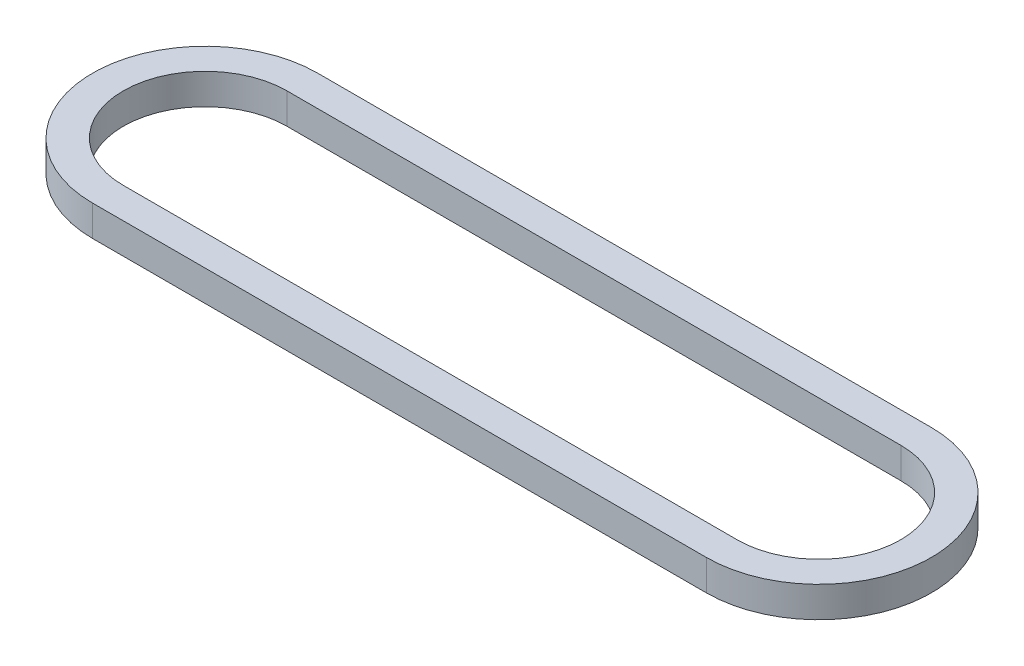
ISO-10303-21;
HEADER;
FILE_DESCRIPTION(('STEP AP214'),'2;1');
FILE_NAME('part.step','',(''),(''),'','','');
FILE_SCHEMA(('AUTOMOTIVE_DESIGN { 1 0 10303 214 1 1 1 1 }'));
ENDSEC;
DATA;
#1=APPLICATION_CONTEXT('core data for automotive mechanical design processes');
#2=APPLICATION_PROTOCOL_DEFINITION('international standard','automotive_design',2000,#1);
#3=PRODUCT_CONTEXT('',#1,'mechanical');
#4=PRODUCT('Part','Part','',(#3));
#5=PRODUCT_RELATED_PRODUCT_CATEGORY('part','',(#4));
#6=PRODUCT_DEFINITION_FORMATION('','',#4);
#7=PRODUCT_DEFINITION_CONTEXT('part definition',#1,'design');
#8=PRODUCT_DEFINITION('design','',#6,#7);
#9=PRODUCT_DEFINITION_SHAPE('','',#8);
#10=(LENGTH_UNIT() NAMED_UNIT(*) SI_UNIT(.MILLI.,.METRE.));
#11=(NAMED_UNIT(*) PLANE_ANGLE_UNIT() SI_UNIT($,.RADIAN.));
#12=(NAMED_UNIT(*) SI_UNIT($,.STERADIAN.) SOLID_ANGLE_UNIT());
#13=UNCERTAINTY_MEASURE_WITH_UNIT(LENGTH_MEASURE(1.E-05),#10,'distance_accuracy_value','');
#14=(GEOMETRIC_REPRESENTATION_CONTEXT(3) GLOBAL_UNCERTAINTY_ASSIGNED_CONTEXT((#13)) GLOBAL_UNIT_ASSIGNED_CONTEXT((#10,
#11,#12)) REPRESENTATION_CONTEXT('',''));
#15=CARTESIAN_POINT('',(0.,0.,0.));
#16=DIRECTION('',(0.,0.,1.));
#17=DIRECTION('',(1.,0.,0.));
#18=AXIS2_PLACEMENT_3D('',#15,#16,#17);
#19=CARTESIAN_POINT('',(-76.2,7.62,0.));
#20=DIRECTION('',(0.,1.,0.));
#21=DIRECTION('',(0.,0.,1.));
#22=AXIS2_PLACEMENT_3D('',#19,#20,#21);
#23=PLANE('',#22);
#24=CARTESIAN_POINT('',(-76.2,7.62,0.));
#25=DIRECTION('',(0.,1.,0.));
#26=DIRECTION('',(0.,0.,1.));
#27=AXIS2_PLACEMENT_3D('',#24,#25,#26);
#28=CIRCLE('',#27,27.94);
#29=CARTESIAN_POINT('',(-76.2,7.62,-27.94));
#30=VERTEX_POINT('',#29);
#31=CARTESIAN_POINT('',(-76.2,7.62,27.94));
#32=VERTEX_POINT('',#31);
#33=EDGE_CURVE('E153',#30,#32,#28,.T.);
#34=ORIENTED_EDGE('',*,*,#33,.T.);
#35=DIRECTION('',(1.,0.,0.));
#36=VECTOR('',#35,1.);
#37=CARTESIAN_POINT('',(-76.2,7.62,27.94));
#38=LINE('',#37,#36);
#39=CARTESIAN_POINT('',(76.2,7.62,27.94));
#40=VERTEX_POINT('',#39);
#41=EDGE_CURVE('E157',#32,#40,#38,.T.);
#42=ORIENTED_EDGE('',*,*,#41,.T.);
#43=CARTESIAN_POINT('',(76.2,7.62,0.));
#44=DIRECTION('',(0.,1.,0.));
#45=DIRECTION('',(0.,0.,1.));
#46=AXIS2_PLACEMENT_3D('',#43,#44,#45);
#47=CIRCLE('',#46,27.94);
#48=CARTESIAN_POINT('',(76.2,7.62,-27.94));
#49=VERTEX_POINT('',#48);
#50=EDGE_CURVE('E161',#40,#49,#47,.T.);
#51=ORIENTED_EDGE('',*,*,#50,.T.);
#52=DIRECTION('',(-1.,0.,0.));
#53=VECTOR('',#52,1.);
#54=CARTESIAN_POINT('',(-76.2,7.62,-27.94));
#55=LINE('',#54,#53);
#56=EDGE_CURVE('E164',#49,#30,#55,.T.);
#57=ORIENTED_EDGE('',*,*,#56,.T.);
#58=EDGE_LOOP('',(#34,#42,#51,#57));
#59=FACE_BOUND('',#58,.T.);
#60=DIRECTION('',(1.,0.,0.));
#61=VECTOR('',#60,1.);
#62=CARTESIAN_POINT('',(-76.2,7.62,20.32));
#63=LINE('',#62,#61);
#64=CARTESIAN_POINT('',(-76.2,7.62,20.32));
#65=VERTEX_POINT('',#64);
#66=CARTESIAN_POINT('',(76.2,7.62,20.32));
#67=VERTEX_POINT('',#66);
#68=EDGE_CURVE('E114',#65,#67,#63,.T.);
#69=ORIENTED_EDGE('',*,*,#68,.F.);
#70=CARTESIAN_POINT('',(-76.2,7.62,0.));
#71=DIRECTION('',(0.,1.,0.));
#72=DIRECTION('',(0.,0.,1.));
#73=AXIS2_PLACEMENT_3D('',#70,#71,#72);
#74=CIRCLE('',#73,20.32);
#75=CARTESIAN_POINT('',(-76.2,7.62,-20.32));
#76=VERTEX_POINT('',#75);
#77=EDGE_CURVE('E105',#76,#65,#74,.T.);
#78=ORIENTED_EDGE('',*,*,#77,.F.);
#79=DIRECTION('',(-1.,0.,0.));
#80=VECTOR('',#79,1.);
#81=CARTESIAN_POINT('',(-76.2,7.62,-20.32));
#82=LINE('',#81,#80);
#83=CARTESIAN_POINT('',(76.2,7.62,-20.3200000000001));
#84=VERTEX_POINT('',#83);
#85=EDGE_CURVE('E131',#84,#76,#82,.T.);
#86=ORIENTED_EDGE('',*,*,#85,.F.);
#87=CARTESIAN_POINT('',(76.2,7.62,0.));
#88=DIRECTION('',(0.,1.,0.));
#89=DIRECTION('',(0.,0.,1.));
#90=AXIS2_PLACEMENT_3D('',#87,#88,#89);
#91=CIRCLE('',#90,20.32);
#92=EDGE_CURVE('E127',#67,#84,#91,.T.);
#93=ORIENTED_EDGE('',*,*,#92,.F.);
#94=EDGE_LOOP('',(#69,#78,#86,#93));
#95=FACE_BOUND('',#94,.T.);
#96=ADVANCED_FACE('F39',(#59,#95),#23,.T.);
#97=CARTESIAN_POINT('',(-76.2,0.,0.));
#98=DIRECTION('',(0.,1.,0.));
#99=DIRECTION('',(0.,0.,1.));
#100=AXIS2_PLACEMENT_3D('',#97,#98,#99);
#101=PLANE('',#100);
#102=CARTESIAN_POINT('',(-76.2,0.,0.));
#103=DIRECTION('',(0.,1.,0.));
#104=DIRECTION('',(0.,0.,1.));
#105=AXIS2_PLACEMENT_3D('',#102,#103,#104);
#106=CIRCLE('',#105,27.94);
#107=CARTESIAN_POINT('',(-76.2,0.,-27.94));
#108=VERTEX_POINT('',#107);
#109=CARTESIAN_POINT('',(-76.2,0.,27.94));
#110=VERTEX_POINT('',#109);
#111=EDGE_CURVE('E123',#108,#110,#106,.T.);
#112=ORIENTED_EDGE('',*,*,#111,.F.);
#113=DIRECTION('',(-1.,0.,0.));
#114=VECTOR('',#113,1.);
#115=CARTESIAN_POINT('',(-76.2,0.,-27.94));
#116=LINE('',#115,#114);
#117=CARTESIAN_POINT('',(76.2,0.,-27.94));
#118=VERTEX_POINT('',#117);
#119=EDGE_CURVE('E158',#118,#108,#116,.T.);
#120=ORIENTED_EDGE('',*,*,#119,.F.);
#121=CARTESIAN_POINT('',(76.2,0.,0.));
#122=DIRECTION('',(0.,1.,0.));
#123=DIRECTION('',(0.,0.,1.));
#124=AXIS2_PLACEMENT_3D('',#121,#122,#123);
#125=CIRCLE('',#124,27.94);
#126=CARTESIAN_POINT('',(76.2,0.,27.94));
#127=VERTEX_POINT('',#126);
#128=EDGE_CURVE('E174',#127,#118,#125,.T.);
#129=ORIENTED_EDGE('',*,*,#128,.F.);
#130=DIRECTION('',(1.,0.,0.));
#131=VECTOR('',#130,1.);
#132=CARTESIAN_POINT('',(-76.2,0.,27.94));
#133=LINE('',#132,#131);
#134=EDGE_CURVE('E171',#110,#127,#133,.T.);
#135=ORIENTED_EDGE('',*,*,#134,.F.);
#136=EDGE_LOOP('',(#112,#120,#129,#135));
#137=FACE_BOUND('',#136,.T.);
#138=CARTESIAN_POINT('',(-76.2,0.,0.));
#139=DIRECTION('',(0.,1.,0.));
#140=DIRECTION('',(0.,0.,1.));
#141=AXIS2_PLACEMENT_3D('',#138,#139,#140);
#142=CIRCLE('',#141,20.32);
#143=CARTESIAN_POINT('',(-76.2,0.,-20.32));
#144=VERTEX_POINT('',#143);
#145=CARTESIAN_POINT('',(-76.2,0.,20.32));
#146=VERTEX_POINT('',#145);
#147=EDGE_CURVE('E63',#144,#146,#142,.T.);
#148=ORIENTED_EDGE('',*,*,#147,.T.);
#149=DIRECTION('',(1.,0.,0.));
#150=VECTOR('',#149,1.);
#151=CARTESIAN_POINT('',(-76.2,0.,20.32));
#152=LINE('',#151,#150);
#153=CARTESIAN_POINT('',(76.2,0.,20.32));
#154=VERTEX_POINT('',#153);
#155=EDGE_CURVE('E121',#146,#154,#152,.T.);
#156=ORIENTED_EDGE('',*,*,#155,.T.);
#157=CARTESIAN_POINT('',(76.2,0.,0.));
#158=DIRECTION('',(0.,1.,0.));
#159=DIRECTION('',(0.,0.,1.));
#160=AXIS2_PLACEMENT_3D('',#157,#158,#159);
#161=CIRCLE('',#160,20.32);
#162=CARTESIAN_POINT('',(76.2,0.,-20.3200000000001));
#163=VERTEX_POINT('',#162);
#164=EDGE_CURVE('E140',#154,#163,#161,.T.);
#165=ORIENTED_EDGE('',*,*,#164,.T.);
#166=DIRECTION('',(-1.,0.,0.));
#167=VECTOR('',#166,1.);
#168=CARTESIAN_POINT('',(-76.2,0.,-20.32));
#169=LINE('',#168,#167);
#170=EDGE_CURVE('E115',#163,#144,#169,.T.);
#171=ORIENTED_EDGE('',*,*,#170,.T.);
#172=EDGE_LOOP('',(#148,#156,#165,#171));
#173=FACE_BOUND('',#172,.T.);
#174=ADVANCED_FACE('F197',(#137,#173),#101,.F.);
#175=CARTESIAN_POINT('',(-76.2,7.62,0.));
#176=DIRECTION('',(0.,-1.,0.));
#177=DIRECTION('',(0.,0.,-1.));
#178=AXIS2_PLACEMENT_3D('',#175,#176,#177);
#179=CYLINDRICAL_SURFACE('',#178,27.94);
#180=ORIENTED_EDGE('',*,*,#111,.T.);
#181=DIRECTION('',(0.,-1.,0.));
#182=VECTOR('',#181,1.);
#183=CARTESIAN_POINT('',(-76.2,7.62,27.94));
#184=LINE('',#183,#182);
#185=EDGE_CURVE('E11',#32,#110,#184,.T.);
#186=ORIENTED_EDGE('',*,*,#185,.F.);
#187=ORIENTED_EDGE('',*,*,#33,.F.);
#188=DIRECTION('',(0.,-1.,0.));
#189=VECTOR('',#188,1.);
#190=CARTESIAN_POINT('',(-76.2,7.62,-27.94));
#191=LINE('',#190,#189);
#192=EDGE_CURVE('E167',#30,#108,#191,.T.);
#193=ORIENTED_EDGE('',*,*,#192,.T.);
#194=EDGE_LOOP('',(#180,#186,#187,#193));
#195=FACE_BOUND('',#194,.T.);
#196=ADVANCED_FACE('F41',(#195),#179,.T.);
#197=CARTESIAN_POINT('',(-76.2,7.62,27.94));
#198=DIRECTION('',(0.,0.,-1.));
#199=DIRECTION('',(-1.,0.,0.));
#200=AXIS2_PLACEMENT_3D('',#197,#198,#199);
#201=PLANE('',#200);
#202=ORIENTED_EDGE('',*,*,#134,.T.);
#203=DIRECTION('',(0.,-1.,0.));
#204=VECTOR('',#203,1.);
#205=CARTESIAN_POINT('',(76.2,7.62,27.94));
#206=LINE('',#205,#204);
#207=EDGE_CURVE('E48',#40,#127,#206,.T.);
#208=ORIENTED_EDGE('',*,*,#207,.F.);
#209=ORIENTED_EDGE('',*,*,#41,.F.);
#210=ORIENTED_EDGE('',*,*,#185,.T.);
#211=EDGE_LOOP('',(#202,#208,#209,#210));
#212=FACE_BOUND('',#211,.T.);
#213=ADVANCED_FACE('F207',(#212),#201,.F.);
#214=CARTESIAN_POINT('',(76.2,7.62,0.));
#215=DIRECTION('',(0.,-1.,0.));
#216=DIRECTION('',(0.,0.,-1.));
#217=AXIS2_PLACEMENT_3D('',#214,#215,#216);
#218=CYLINDRICAL_SURFACE('',#217,27.94);
#219=ORIENTED_EDGE('',*,*,#128,.T.);
#220=DIRECTION('',(0.,-1.,0.));
#221=VECTOR('',#220,1.);
#222=CARTESIAN_POINT('',(76.2,7.62,-27.94));
#223=LINE('',#222,#221);
#224=EDGE_CURVE('E182',#49,#118,#223,.T.);
#225=ORIENTED_EDGE('',*,*,#224,.F.);
#226=ORIENTED_EDGE('',*,*,#50,.F.);
#227=ORIENTED_EDGE('',*,*,#207,.T.);
#228=EDGE_LOOP('',(#219,#225,#226,#227));
#229=FACE_BOUND('',#228,.T.);
#230=ADVANCED_FACE('F191',(#229),#218,.T.);
#231=CARTESIAN_POINT('',(-76.2,7.62,-27.94));
#232=DIRECTION('',(0.,0.,1.));
#233=DIRECTION('',(1.,0.,0.));
#234=AXIS2_PLACEMENT_3D('',#231,#232,#233);
#235=PLANE('',#234);
#236=ORIENTED_EDGE('',*,*,#119,.T.);
#237=ORIENTED_EDGE('',*,*,#192,.F.);
#238=ORIENTED_EDGE('',*,*,#56,.F.);
#239=ORIENTED_EDGE('',*,*,#224,.T.);
#240=EDGE_LOOP('',(#236,#237,#238,#239));
#241=FACE_BOUND('',#240,.T.);
#242=ADVANCED_FACE('F201',(#241),#235,.F.);
#243=CARTESIAN_POINT('',(-76.2,7.62,0.));
#244=DIRECTION('',(0.,-1.,0.));
#245=DIRECTION('',(0.,0.,-1.));
#246=AXIS2_PLACEMENT_3D('',#243,#244,#245);
#247=CYLINDRICAL_SURFACE('',#246,20.32);
#248=ORIENTED_EDGE('',*,*,#147,.F.);
#249=DIRECTION('',(0.,-1.,0.));
#250=VECTOR('',#249,1.);
#251=CARTESIAN_POINT('',(-76.2,7.62,-20.32));
#252=LINE('',#251,#250);
#253=EDGE_CURVE('E109',#76,#144,#252,.T.);
#254=ORIENTED_EDGE('',*,*,#253,.F.);
#255=ORIENTED_EDGE('',*,*,#77,.T.);
#256=DIRECTION('',(0.,-1.,0.));
#257=VECTOR('',#256,1.);
#258=CARTESIAN_POINT('',(-76.2,7.62,20.32));
#259=LINE('',#258,#257);
#260=EDGE_CURVE('E108',#65,#146,#259,.T.);
#261=ORIENTED_EDGE('',*,*,#260,.T.);
#262=EDGE_LOOP('',(#248,#254,#255,#261));
#263=FACE_BOUND('',#262,.T.);
#264=ADVANCED_FACE('F107',(#263),#247,.F.);
#265=CARTESIAN_POINT('',(-76.2,7.62,20.32));
#266=DIRECTION('',(0.,0.,-1.));
#267=DIRECTION('',(-1.,0.,0.));
#268=AXIS2_PLACEMENT_3D('',#265,#266,#267);
#269=PLANE('',#268);
#270=ORIENTED_EDGE('',*,*,#155,.F.);
#271=ORIENTED_EDGE('',*,*,#260,.F.);
#272=ORIENTED_EDGE('',*,*,#68,.T.);
#273=DIRECTION('',(0.,-1.,0.));
#274=VECTOR('',#273,1.);
#275=CARTESIAN_POINT('',(76.2,7.62,20.32));
#276=LINE('',#275,#274);
#277=EDGE_CURVE('E124',#67,#154,#276,.T.);
#278=ORIENTED_EDGE('',*,*,#277,.T.);
#279=EDGE_LOOP('',(#270,#271,#272,#278));
#280=FACE_BOUND('',#279,.T.);
#281=ADVANCED_FACE('F118',(#280),#269,.T.);
#282=CARTESIAN_POINT('',(76.2,7.62,0.));
#283=DIRECTION('',(0.,-1.,0.));
#284=DIRECTION('',(0.,0.,-1.));
#285=AXIS2_PLACEMENT_3D('',#282,#283,#284);
#286=CYLINDRICAL_SURFACE('',#285,20.32);
#287=ORIENTED_EDGE('',*,*,#164,.F.);
#288=ORIENTED_EDGE('',*,*,#277,.F.);
#289=ORIENTED_EDGE('',*,*,#92,.T.);
#290=DIRECTION('',(0.,-1.,0.));
#291=VECTOR('',#290,1.);
#292=CARTESIAN_POINT('',(76.2,7.62,-20.3200000000001));
#293=LINE('',#292,#291);
#294=EDGE_CURVE('E55',#84,#163,#293,.T.);
#295=ORIENTED_EDGE('',*,*,#294,.T.);
#296=EDGE_LOOP('',(#287,#288,#289,#295));
#297=FACE_BOUND('',#296,.T.);
#298=ADVANCED_FACE('F230',(#297),#286,.F.);
#299=CARTESIAN_POINT('',(-76.2,7.62,-20.32));
#300=DIRECTION('',(0.,0.,1.));
#301=DIRECTION('',(1.,0.,0.));
#302=AXIS2_PLACEMENT_3D('',#299,#300,#301);
#303=PLANE('',#302);
#304=ORIENTED_EDGE('',*,*,#170,.F.);
#305=ORIENTED_EDGE('',*,*,#294,.F.);
#306=ORIENTED_EDGE('',*,*,#85,.T.);
#307=ORIENTED_EDGE('',*,*,#253,.T.);
#308=EDGE_LOOP('',(#304,#305,#306,#307));
#309=FACE_BOUND('',#308,.T.);
#310=ADVANCED_FACE('F234',(#309),#303,.T.);
#311=CLOSED_SHELL('',(#96,#174,#196,#213,#230,#242,#264,#281,#298,#310));
#312=MANIFOLD_SOLID_BREP('B2',#311);
#313=ADVANCED_BREP_SHAPE_REPRESENTATION('',(#18,#312),#14);
#314=SHAPE_DEFINITION_REPRESENTATION(#9,#313);
ENDSEC;
END-ISO-10303-21;
